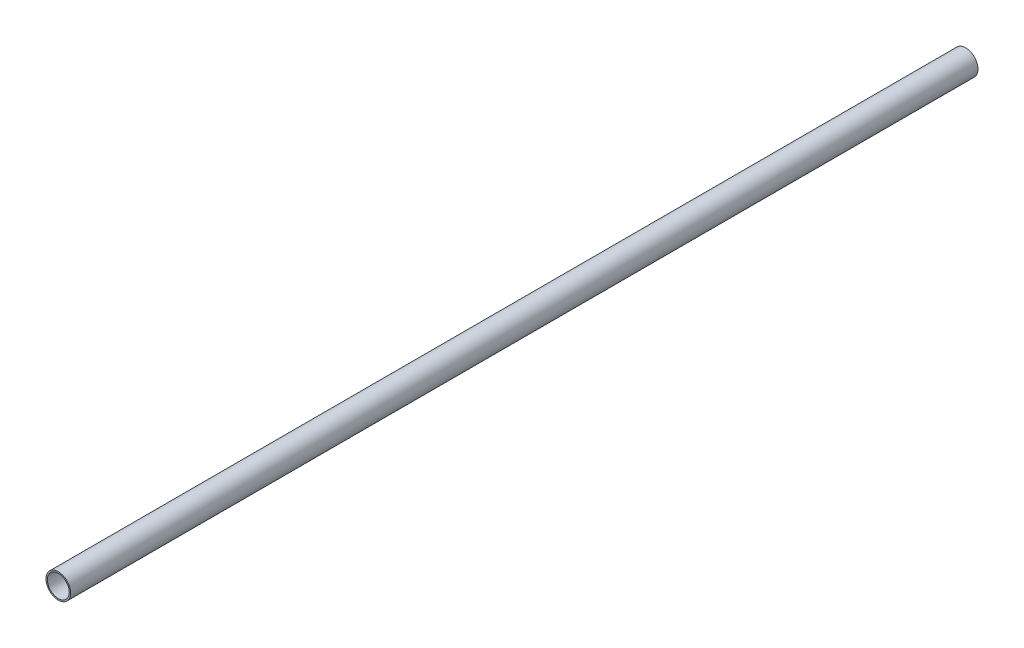
ISO-10303-21;
HEADER;
FILE_DESCRIPTION(('STEP AP214'),'2;1');
FILE_NAME('part.step','',(''),(''),'','','');
FILE_SCHEMA(('AUTOMOTIVE_DESIGN { 1 0 10303 214 1 1 1 1 }'));
ENDSEC;
DATA;
#1=APPLICATION_CONTEXT('core data for automotive mechanical design processes');
#2=APPLICATION_PROTOCOL_DEFINITION('international standard','automotive_design',2000,#1);
#3=PRODUCT_CONTEXT('',#1,'mechanical');
#4=PRODUCT('Part','Part','',(#3));
#5=PRODUCT_RELATED_PRODUCT_CATEGORY('part','',(#4));
#6=PRODUCT_DEFINITION_FORMATION('','',#4);
#7=PRODUCT_DEFINITION_CONTEXT('part definition',#1,'design');
#8=PRODUCT_DEFINITION('design','',#6,#7);
#9=PRODUCT_DEFINITION_SHAPE('','',#8);
#10=(LENGTH_UNIT() NAMED_UNIT(*) SI_UNIT(.MILLI.,.METRE.));
#11=(NAMED_UNIT(*) PLANE_ANGLE_UNIT() SI_UNIT($,.RADIAN.));
#12=(NAMED_UNIT(*) SI_UNIT($,.STERADIAN.) SOLID_ANGLE_UNIT());
#13=UNCERTAINTY_MEASURE_WITH_UNIT(LENGTH_MEASURE(1.E-05),#10,'distance_accuracy_value','');
#14=(GEOMETRIC_REPRESENTATION_CONTEXT(3) GLOBAL_UNCERTAINTY_ASSIGNED_CONTEXT((#13)) GLOBAL_UNIT_ASSIGNED_CONTEXT((#10,
#11,#12)) REPRESENTATION_CONTEXT('',''));
#15=CARTESIAN_POINT('',(0.,0.,0.));
#16=DIRECTION('',(0.,0.,1.));
#17=DIRECTION('',(1.,0.,0.));
#18=AXIS2_PLACEMENT_3D('',#15,#16,#17);
#19=CARTESIAN_POINT('',(0.,0.,292.1));
#20=DIRECTION('',(0.,0.,1.));
#21=DIRECTION('',(1.,0.,0.));
#22=AXIS2_PLACEMENT_3D('',#19,#20,#21);
#23=PLANE('',#22);
#24=CARTESIAN_POINT('',(0.,0.,292.1));
#25=DIRECTION('',(0.,0.,1.));
#26=DIRECTION('',(1.,0.,0.));
#27=AXIS2_PLACEMENT_3D('',#24,#25,#26);
#28=CIRCLE('',#27,7.9375);
#29=CARTESIAN_POINT('',(7.9375,0.,292.1));
#30=VERTEX_POINT('',#29);
#31=EDGE_CURVE('E10',#30,#30,#28,.T.);
#32=ORIENTED_EDGE('',*,*,#31,.T.);
#33=EDGE_LOOP('',(#32));
#34=FACE_BOUND('',#33,.T.);
#35=CARTESIAN_POINT('',(0.,0.,292.1));
#36=DIRECTION('',(0.,0.,1.));
#37=DIRECTION('',(1.,0.,0.));
#38=AXIS2_PLACEMENT_3D('',#35,#36,#37);
#39=CIRCLE('',#38,7.0485);
#40=CARTESIAN_POINT('',(7.0485,0.,292.1));
#41=VERTEX_POINT('',#40);
#42=EDGE_CURVE('E56',#41,#41,#39,.T.);
#43=ORIENTED_EDGE('',*,*,#42,.F.);
#44=EDGE_LOOP('',(#43));
#45=FACE_BOUND('',#44,.T.);
#46=ADVANCED_FACE('F43',(#34,#45),#23,.T.);
#47=CARTESIAN_POINT('',(0.,0.,-292.1));
#48=DIRECTION('',(0.,0.,1.));
#49=DIRECTION('',(1.,0.,0.));
#50=AXIS2_PLACEMENT_3D('',#47,#48,#49);
#51=PLANE('',#50);
#52=CARTESIAN_POINT('',(0.,0.,-292.1));
#53=DIRECTION('',(0.,0.,1.));
#54=DIRECTION('',(1.,0.,0.));
#55=AXIS2_PLACEMENT_3D('',#52,#53,#54);
#56=CIRCLE('',#55,7.9375);
#57=CARTESIAN_POINT('',(7.9375,0.,-292.1));
#58=VERTEX_POINT('',#57);
#59=EDGE_CURVE('E47',#58,#58,#56,.T.);
#60=ORIENTED_EDGE('',*,*,#59,.F.);
#61=EDGE_LOOP('',(#60));
#62=FACE_BOUND('',#61,.T.);
#63=CARTESIAN_POINT('',(0.,0.,-292.1));
#64=DIRECTION('',(0.,0.,1.));
#65=DIRECTION('',(1.,0.,0.));
#66=AXIS2_PLACEMENT_3D('',#63,#64,#65);
#67=CIRCLE('',#66,7.0485);
#68=CARTESIAN_POINT('',(7.0485,0.,-292.1));
#69=VERTEX_POINT('',#68);
#70=EDGE_CURVE('E58',#69,#69,#67,.T.);
#71=ORIENTED_EDGE('',*,*,#70,.T.);
#72=EDGE_LOOP('',(#71));
#73=FACE_BOUND('',#72,.T.);
#74=ADVANCED_FACE('F70',(#62,#73),#51,.F.);
#75=CARTESIAN_POINT('',(0.,0.,292.1));
#76=DIRECTION('',(0.,0.,-1.));
#77=DIRECTION('',(-1.,0.,0.));
#78=AXIS2_PLACEMENT_3D('',#75,#76,#77);
#79=CYLINDRICAL_SURFACE('',#78,7.9375);
#80=ORIENTED_EDGE('',*,*,#31,.F.);
#81=EDGE_LOOP('',(#80));
#82=FACE_BOUND('',#81,.T.);
#83=ORIENTED_EDGE('',*,*,#59,.T.);
#84=EDGE_LOOP('',(#83));
#85=FACE_BOUND('',#84,.T.);
#86=ADVANCED_FACE('F45',(#82,#85),#79,.T.);
#87=CARTESIAN_POINT('',(0.,0.,292.1));
#88=DIRECTION('',(0.,0.,-1.));
#89=DIRECTION('',(-1.,0.,0.));
#90=AXIS2_PLACEMENT_3D('',#87,#88,#89);
#91=CYLINDRICAL_SURFACE('',#90,7.0485);
#92=ORIENTED_EDGE('',*,*,#42,.T.);
#93=EDGE_LOOP('',(#92));
#94=FACE_BOUND('',#93,.T.);
#95=ORIENTED_EDGE('',*,*,#70,.F.);
#96=EDGE_LOOP('',(#95));
#97=FACE_BOUND('',#96,.T.);
#98=ADVANCED_FACE('F66',(#94,#97),#91,.F.);
#99=CLOSED_SHELL('',(#46,#74,#86,#98));
#100=MANIFOLD_SOLID_BREP('B2',#99);
#101=ADVANCED_BREP_SHAPE_REPRESENTATION('',(#18,#100),#14);
#102=SHAPE_DEFINITION_REPRESENTATION(#9,#101);
ENDSEC;
END-ISO-10303-21;
